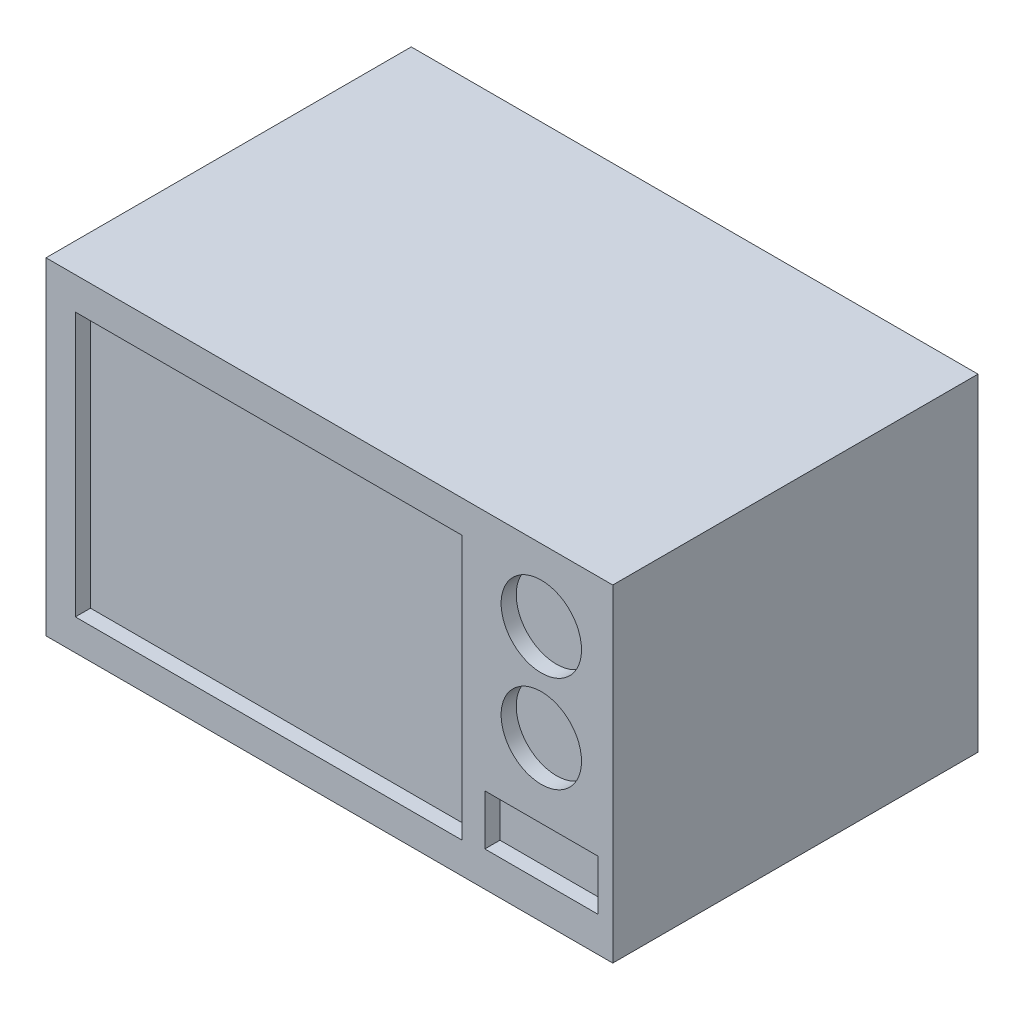
ISO-10303-21;
HEADER;
FILE_DESCRIPTION(('STEP AP214'),'2;1');
FILE_NAME('part.step','',(''),(''),'','','');
FILE_SCHEMA(('AUTOMOTIVE_DESIGN { 1 0 10303 214 1 1 1 1 }'));
ENDSEC;
DATA;
#1=APPLICATION_CONTEXT('core data for automotive mechanical design processes');
#2=APPLICATION_PROTOCOL_DEFINITION('international standard','automotive_design',2000,#1);
#3=PRODUCT_CONTEXT('',#1,'mechanical');
#4=PRODUCT('Part','Part','',(#3));
#5=PRODUCT_RELATED_PRODUCT_CATEGORY('part','',(#4));
#6=PRODUCT_DEFINITION_FORMATION('','',#4);
#7=PRODUCT_DEFINITION_CONTEXT('part definition',#1,'design');
#8=PRODUCT_DEFINITION('design','',#6,#7);
#9=PRODUCT_DEFINITION_SHAPE('','',#8);
#10=(LENGTH_UNIT() NAMED_UNIT(*) SI_UNIT(.MILLI.,.METRE.));
#11=(NAMED_UNIT(*) PLANE_ANGLE_UNIT() SI_UNIT($,.RADIAN.));
#12=(NAMED_UNIT(*) SI_UNIT($,.STERADIAN.) SOLID_ANGLE_UNIT());
#13=UNCERTAINTY_MEASURE_WITH_UNIT(LENGTH_MEASURE(1.E-05),#10,'distance_accuracy_value','');
#14=(GEOMETRIC_REPRESENTATION_CONTEXT(3) GLOBAL_UNCERTAINTY_ASSIGNED_CONTEXT((#13)) GLOBAL_UNIT_ASSIGNED_CONTEXT((#10,
#11,#12)) REPRESENTATION_CONTEXT('',''));
#15=CARTESIAN_POINT('',(0.,0.,0.));
#16=DIRECTION('',(0.,0.,1.));
#17=DIRECTION('',(1.,0.,0.));
#18=AXIS2_PLACEMENT_3D('',#15,#16,#17);
#19=CARTESIAN_POINT('',(225.,260.,-145.));
#20=DIRECTION('',(-1.,0.,0.));
#21=DIRECTION('',(0.,0.,1.));
#22=AXIS2_PLACEMENT_3D('',#19,#20,#21);
#23=PLANE('',#22);
#24=DIRECTION('',(0.,0.,-1.));
#25=VECTOR('',#24,1.);
#26=CARTESIAN_POINT('',(225.,0.,-145.));
#27=LINE('',#26,#25);
#28=CARTESIAN_POINT('',(225.,0.,145.));
#29=VERTEX_POINT('',#28);
#30=CARTESIAN_POINT('',(225.,0.,-145.));
#31=VERTEX_POINT('',#30);
#32=EDGE_CURVE('E227',#29,#31,#27,.T.);
#33=ORIENTED_EDGE('',*,*,#32,.T.);
#34=DIRECTION('',(0.,-1.,0.));
#35=VECTOR('',#34,1.);
#36=CARTESIAN_POINT('',(225.,260.,-145.));
#37=LINE('',#36,#35);
#38=CARTESIAN_POINT('',(225.,260.,-145.));
#39=VERTEX_POINT('',#38);
#40=EDGE_CURVE('E11',#39,#31,#37,.T.);
#41=ORIENTED_EDGE('',*,*,#40,.F.);
#42=DIRECTION('',(0.,0.,-1.));
#43=VECTOR('',#42,1.);
#44=CARTESIAN_POINT('',(225.,260.,-145.));
#45=LINE('',#44,#43);
#46=CARTESIAN_POINT('',(225.,260.,145.));
#47=VERTEX_POINT('',#46);
#48=EDGE_CURVE('E233',#47,#39,#45,.T.);
#49=ORIENTED_EDGE('',*,*,#48,.F.);
#50=DIRECTION('',(0.,-1.,0.));
#51=VECTOR('',#50,1.);
#52=CARTESIAN_POINT('',(225.,260.,145.));
#53=LINE('',#52,#51);
#54=EDGE_CURVE('E247',#47,#29,#53,.T.);
#55=ORIENTED_EDGE('',*,*,#54,.T.);
#56=EDGE_LOOP('',(#33,#41,#49,#55));
#57=FACE_BOUND('',#56,.T.);
#58=ADVANCED_FACE('F39',(#57),#23,.F.);
#59=CARTESIAN_POINT('',(-225.,260.,-145.));
#60=DIRECTION('',(0.,0.,1.));
#61=DIRECTION('',(1.,0.,0.));
#62=AXIS2_PLACEMENT_3D('',#59,#60,#61);
#63=PLANE('',#62);
#64=DIRECTION('',(-1.,0.,0.));
#65=VECTOR('',#64,1.);
#66=CARTESIAN_POINT('',(-225.,0.,-145.));
#67=LINE('',#66,#65);
#68=CARTESIAN_POINT('',(-225.,0.,-145.));
#69=VERTEX_POINT('',#68);
#70=EDGE_CURVE('E251',#31,#69,#67,.T.);
#71=ORIENTED_EDGE('',*,*,#70,.T.);
#72=DIRECTION('',(0.,-1.,0.));
#73=VECTOR('',#72,1.);
#74=CARTESIAN_POINT('',(-225.,260.,-145.));
#75=LINE('',#74,#73);
#76=CARTESIAN_POINT('',(-225.,260.,-145.));
#77=VERTEX_POINT('',#76);
#78=EDGE_CURVE('E47',#77,#69,#75,.T.);
#79=ORIENTED_EDGE('',*,*,#78,.F.);
#80=DIRECTION('',(-1.,0.,0.));
#81=VECTOR('',#80,1.);
#82=CARTESIAN_POINT('',(-225.,260.,-145.));
#83=LINE('',#82,#81);
#84=EDGE_CURVE('E237',#39,#77,#83,.T.);
#85=ORIENTED_EDGE('',*,*,#84,.F.);
#86=ORIENTED_EDGE('',*,*,#40,.T.);
#87=EDGE_LOOP('',(#71,#79,#85,#86));
#88=FACE_BOUND('',#87,.T.);
#89=ADVANCED_FACE('F287',(#88),#63,.F.);
#90=CARTESIAN_POINT('',(-225.,260.,-145.));
#91=DIRECTION('',(1.,0.,0.));
#92=DIRECTION('',(0.,0.,-1.));
#93=AXIS2_PLACEMENT_3D('',#90,#91,#92);
#94=PLANE('',#93);
#95=DIRECTION('',(0.,0.,1.));
#96=VECTOR('',#95,1.);
#97=CARTESIAN_POINT('',(-225.,0.,-145.));
#98=LINE('',#97,#96);
#99=CARTESIAN_POINT('',(-225.,0.,145.));
#100=VERTEX_POINT('',#99);
#101=EDGE_CURVE('E254',#69,#100,#98,.T.);
#102=ORIENTED_EDGE('',*,*,#101,.T.);
#103=DIRECTION('',(0.,-1.,0.));
#104=VECTOR('',#103,1.);
#105=CARTESIAN_POINT('',(-225.,260.,145.));
#106=LINE('',#105,#104);
#107=CARTESIAN_POINT('',(-225.,260.,145.));
#108=VERTEX_POINT('',#107);
#109=EDGE_CURVE('E262',#108,#100,#106,.T.);
#110=ORIENTED_EDGE('',*,*,#109,.F.);
#111=DIRECTION('',(0.,0.,1.));
#112=VECTOR('',#111,1.);
#113=CARTESIAN_POINT('',(-225.,260.,-145.));
#114=LINE('',#113,#112);
#115=EDGE_CURVE('E241',#77,#108,#114,.T.);
#116=ORIENTED_EDGE('',*,*,#115,.F.);
#117=ORIENTED_EDGE('',*,*,#78,.T.);
#118=EDGE_LOOP('',(#102,#110,#116,#117));
#119=FACE_BOUND('',#118,.T.);
#120=ADVANCED_FACE('F271',(#119),#94,.F.);
#121=CARTESIAN_POINT('',(-225.,260.,145.));
#122=DIRECTION('',(0.,0.,-1.));
#123=DIRECTION('',(-1.,0.,0.));
#124=AXIS2_PLACEMENT_3D('',#121,#122,#123);
#125=PLANE('',#124);
#126=DIRECTION('',(-1.,0.,0.));
#127=VECTOR('',#126,1.);
#128=CARTESIAN_POINT('',(-201.676981147842,234.349718550989,145.));
#129=LINE('',#128,#127);
#130=CARTESIAN_POINT('',(105.310715864301,234.349718550989,145.));
#131=VERTEX_POINT('',#130);
#132=CARTESIAN_POINT('',(-201.676981147842,234.349718550989,145.));
#133=VERTEX_POINT('',#132);
#134=EDGE_CURVE('E202',#131,#133,#129,.T.);
#135=ORIENTED_EDGE('',*,*,#134,.F.);
#136=DIRECTION('',(0.,1.,0.));
#137=VECTOR('',#136,1.);
#138=CARTESIAN_POINT('',(105.310715864301,234.349718550989,145.));
#139=LINE('',#138,#137);
#140=CARTESIAN_POINT('',(105.310715864301,24.7169161931593,145.));
#141=VERTEX_POINT('',#140);
#142=EDGE_CURVE('E54',#141,#131,#139,.T.);
#143=ORIENTED_EDGE('',*,*,#142,.F.);
#144=DIRECTION('',(1.,0.,0.));
#145=VECTOR('',#144,1.);
#146=CARTESIAN_POINT('',(-201.676981147842,24.7169161931593,145.));
#147=LINE('',#146,#145);
#148=CARTESIAN_POINT('',(-201.676981147842,24.7169161931593,145.));
#149=VERTEX_POINT('',#148);
#150=EDGE_CURVE('E187',#149,#141,#147,.T.);
#151=ORIENTED_EDGE('',*,*,#150,.F.);
#152=DIRECTION('',(0.,-1.,0.));
#153=VECTOR('',#152,1.);
#154=CARTESIAN_POINT('',(-201.676981147842,234.349718550989,145.));
#155=LINE('',#154,#153);
#156=EDGE_CURVE('E206',#133,#149,#155,.T.);
#157=ORIENTED_EDGE('',*,*,#156,.F.);
#158=EDGE_LOOP('',(#135,#143,#151,#157));
#159=FACE_BOUND('',#158,.T.);
#160=DIRECTION('',(-1.,0.,0.));
#161=VECTOR('',#160,1.);
#162=CARTESIAN_POINT('',(123.433147095085,67.6835893136013,145.));
#163=LINE('',#162,#161);
#164=CARTESIAN_POINT('',(213.118654386862,67.6835893136013,145.));
#165=VERTEX_POINT('',#164);
#166=CARTESIAN_POINT('',(123.433147095085,67.6835893136013,145.));
#167=VERTEX_POINT('',#166);
#168=EDGE_CURVE('E167',#165,#167,#163,.T.);
#169=ORIENTED_EDGE('',*,*,#168,.F.);
#170=DIRECTION('',(0.,1.,0.));
#171=VECTOR('',#170,1.);
#172=CARTESIAN_POINT('',(213.118654386862,67.6835893136013,145.));
#173=LINE('',#172,#171);
#174=CARTESIAN_POINT('',(213.118654386862,27.7112329318119,145.));
#175=VERTEX_POINT('',#174);
#176=EDGE_CURVE('E62',#175,#165,#173,.T.);
#177=ORIENTED_EDGE('',*,*,#176,.F.);
#178=DIRECTION('',(1.,0.,0.));
#179=VECTOR('',#178,1.);
#180=CARTESIAN_POINT('',(123.433147095085,27.7112329318119,145.));
#181=LINE('',#180,#179);
#182=CARTESIAN_POINT('',(123.433147095085,27.7112329318119,145.));
#183=VERTEX_POINT('',#182);
#184=EDGE_CURVE('E151',#183,#175,#181,.T.);
#185=ORIENTED_EDGE('',*,*,#184,.F.);
#186=DIRECTION('',(0.,-1.,0.));
#187=VECTOR('',#186,1.);
#188=CARTESIAN_POINT('',(123.433147095085,67.6835893136013,145.));
#189=LINE('',#188,#187);
#190=EDGE_CURVE('E155',#167,#183,#189,.T.);
#191=ORIENTED_EDGE('',*,*,#190,.F.);
#192=EDGE_LOOP('',(#169,#177,#185,#191));
#193=FACE_BOUND('',#192,.T.);
#194=CARTESIAN_POINT('',(168.275900740974,126.418305405309,145.));
#195=DIRECTION('',(0.,0.,1.));
#196=DIRECTION('',(1.,0.,0.));
#197=AXIS2_PLACEMENT_3D('',#194,#195,#196);
#198=CIRCLE('',#197,31.9152905653367);
#199=CARTESIAN_POINT('',(200.19119130631,126.418305405309,145.));
#200=VERTEX_POINT('',#199);
#201=EDGE_CURVE('E158',#200,#200,#198,.T.);
#202=ORIENTED_EDGE('',*,*,#201,.F.);
#203=EDGE_LOOP('',(#202));
#204=FACE_BOUND('',#203,.T.);
#205=CARTESIAN_POINT('',(168.275900740974,203.066569731717,145.));
#206=DIRECTION('',(0.,0.,1.));
#207=DIRECTION('',(1.,0.,0.));
#208=AXIS2_PLACEMENT_3D('',#205,#206,#207);
#209=CIRCLE('',#208,31.9152905653367);
#210=CARTESIAN_POINT('',(200.19119130631,203.066569731717,145.));
#211=VERTEX_POINT('',#210);
#212=EDGE_CURVE('E228',#211,#211,#209,.T.);
#213=ORIENTED_EDGE('',*,*,#212,.F.);
#214=EDGE_LOOP('',(#213));
#215=FACE_BOUND('',#214,.T.);
#216=DIRECTION('',(1.,0.,0.));
#217=VECTOR('',#216,1.);
#218=CARTESIAN_POINT('',(-225.,0.,145.));
#219=LINE('',#218,#217);
#220=EDGE_CURVE('E238',#100,#29,#219,.T.);
#221=ORIENTED_EDGE('',*,*,#220,.T.);
#222=ORIENTED_EDGE('',*,*,#54,.F.);
#223=DIRECTION('',(1.,0.,0.));
#224=VECTOR('',#223,1.);
#225=CARTESIAN_POINT('',(-225.,260.,145.));
#226=LINE('',#225,#224);
#227=EDGE_CURVE('E244',#108,#47,#226,.T.);
#228=ORIENTED_EDGE('',*,*,#227,.F.);
#229=ORIENTED_EDGE('',*,*,#109,.T.);
#230=EDGE_LOOP('',(#221,#222,#228,#229));
#231=FACE_BOUND('',#230,.T.);
#232=ADVANCED_FACE('F280',(#159,#193,#204,#215,#231),#125,.F.);
#233=CARTESIAN_POINT('',(0.,260.,0.));
#234=DIRECTION('',(0.,1.,0.));
#235=DIRECTION('',(0.,0.,1.));
#236=AXIS2_PLACEMENT_3D('',#233,#234,#235);
#237=PLANE('',#236);
#238=ORIENTED_EDGE('',*,*,#48,.T.);
#239=ORIENTED_EDGE('',*,*,#84,.T.);
#240=ORIENTED_EDGE('',*,*,#115,.T.);
#241=ORIENTED_EDGE('',*,*,#227,.T.);
#242=EDGE_LOOP('',(#238,#239,#240,#241));
#243=FACE_BOUND('',#242,.T.);
#244=ADVANCED_FACE('F286',(#243),#237,.T.);
#245=CARTESIAN_POINT('',(0.,0.,0.));
#246=DIRECTION('',(0.,1.,0.));
#247=DIRECTION('',(0.,0.,1.));
#248=AXIS2_PLACEMENT_3D('',#245,#246,#247);
#249=PLANE('',#248);
#250=ORIENTED_EDGE('',*,*,#32,.F.);
#251=ORIENTED_EDGE('',*,*,#220,.F.);
#252=ORIENTED_EDGE('',*,*,#101,.F.);
#253=ORIENTED_EDGE('',*,*,#70,.F.);
#254=EDGE_LOOP('',(#250,#251,#252,#253));
#255=FACE_BOUND('',#254,.T.);
#256=ADVANCED_FACE('F277',(#255),#249,.F.);
#257=CARTESIAN_POINT('',(168.275900740974,203.066569731717,133.));
#258=DIRECTION('',(0.,0.,1.));
#259=DIRECTION('',(1.,0.,0.));
#260=AXIS2_PLACEMENT_3D('',#257,#258,#259);
#261=CYLINDRICAL_SURFACE('',#260,31.9152905653367);
#262=CARTESIAN_POINT('',(168.275900740974,203.066569731717,133.));
#263=DIRECTION('',(0.,0.,1.));
#264=DIRECTION('',(1.,0.,0.));
#265=AXIS2_PLACEMENT_3D('',#262,#263,#264);
#266=CIRCLE('',#265,31.9152905653367);
#267=CARTESIAN_POINT('',(200.19119130631,203.066569731717,133.));
#268=VERTEX_POINT('',#267);
#269=EDGE_CURVE('E223',#268,#268,#266,.T.);
#270=ORIENTED_EDGE('',*,*,#269,.F.);
#271=EDGE_LOOP('',(#270));
#272=FACE_BOUND('',#271,.T.);
#273=ORIENTED_EDGE('',*,*,#212,.T.);
#274=EDGE_LOOP('',(#273));
#275=FACE_BOUND('',#274,.T.);
#276=ADVANCED_FACE('F300',(#272,#275),#261,.F.);
#277=CARTESIAN_POINT('',(168.275900740974,203.066569731717,133.));
#278=DIRECTION('',(0.,0.,1.));
#279=DIRECTION('',(1.,0.,0.));
#280=AXIS2_PLACEMENT_3D('',#277,#278,#279);
#281=PLANE('',#280);
#282=ORIENTED_EDGE('',*,*,#269,.T.);
#283=EDGE_LOOP('',(#282));
#284=FACE_BOUND('',#283,.T.);
#285=ADVANCED_FACE('F305',(#284),#281,.T.);
#286=CARTESIAN_POINT('',(168.275900740974,126.418305405309,133.));
#287=DIRECTION('',(0.,0.,1.));
#288=DIRECTION('',(1.,0.,0.));
#289=AXIS2_PLACEMENT_3D('',#286,#287,#288);
#290=CYLINDRICAL_SURFACE('',#289,31.9152905653367);
#291=CARTESIAN_POINT('',(168.275900740974,126.418305405309,133.));
#292=DIRECTION('',(0.,0.,1.));
#293=DIRECTION('',(1.,0.,0.));
#294=AXIS2_PLACEMENT_3D('',#291,#292,#293);
#295=CIRCLE('',#294,31.9152905653367);
#296=CARTESIAN_POINT('',(200.19119130631,126.418305405309,133.));
#297=VERTEX_POINT('',#296);
#298=EDGE_CURVE('E232',#297,#297,#295,.T.);
#299=ORIENTED_EDGE('',*,*,#298,.F.);
#300=EDGE_LOOP('',(#299));
#301=FACE_BOUND('',#300,.T.);
#302=ORIENTED_EDGE('',*,*,#201,.T.);
#303=EDGE_LOOP('',(#302));
#304=FACE_BOUND('',#303,.T.);
#305=ADVANCED_FACE('F309',(#301,#304),#290,.F.);
#306=CARTESIAN_POINT('',(168.275900740974,126.418305405309,133.));
#307=DIRECTION('',(0.,0.,1.));
#308=DIRECTION('',(1.,0.,0.));
#309=AXIS2_PLACEMENT_3D('',#306,#307,#308);
#310=PLANE('',#309);
#311=ORIENTED_EDGE('',*,*,#298,.T.);
#312=EDGE_LOOP('',(#311));
#313=FACE_BOUND('',#312,.T.);
#314=ADVANCED_FACE('F333',(#313),#310,.T.);
#315=CARTESIAN_POINT('',(213.118654386862,67.6835893136013,133.));
#316=DIRECTION('',(1.,0.,0.));
#317=DIRECTION('',(0.,0.,-1.));
#318=AXIS2_PLACEMENT_3D('',#315,#316,#317);
#319=PLANE('',#318);
#320=ORIENTED_EDGE('',*,*,#176,.T.);
#321=DIRECTION('',(0.,0.,1.));
#322=VECTOR('',#321,1.);
#323=CARTESIAN_POINT('',(213.118654386862,67.6835893136013,133.));
#324=LINE('',#323,#322);
#325=CARTESIAN_POINT('',(213.118654386862,67.6835893136013,133.));
#326=VERTEX_POINT('',#325);
#327=EDGE_CURVE('E126',#326,#165,#324,.T.);
#328=ORIENTED_EDGE('',*,*,#327,.F.);
#329=DIRECTION('',(0.,1.,0.));
#330=VECTOR('',#329,1.);
#331=CARTESIAN_POINT('',(213.118654386862,67.6835893136013,133.));
#332=LINE('',#331,#330);
#333=CARTESIAN_POINT('',(213.118654386862,27.7112329318119,133.));
#334=VERTEX_POINT('',#333);
#335=EDGE_CURVE('E130',#334,#326,#332,.T.);
#336=ORIENTED_EDGE('',*,*,#335,.F.);
#337=DIRECTION('',(0.,0.,1.));
#338=VECTOR('',#337,1.);
#339=CARTESIAN_POINT('',(213.118654386862,27.7112329318119,133.));
#340=LINE('',#339,#338);
#341=EDGE_CURVE('E174',#334,#175,#340,.T.);
#342=ORIENTED_EDGE('',*,*,#341,.T.);
#343=EDGE_LOOP('',(#320,#328,#336,#342));
#344=FACE_BOUND('',#343,.T.);
#345=ADVANCED_FACE('F128',(#344),#319,.F.);
#346=CARTESIAN_POINT('',(123.433147095085,27.7112329318119,133.));
#347=DIRECTION('',(0.,-1.,0.));
#348=DIRECTION('',(0.,0.,-1.));
#349=AXIS2_PLACEMENT_3D('',#346,#347,#348);
#350=PLANE('',#349);
#351=ORIENTED_EDGE('',*,*,#184,.T.);
#352=ORIENTED_EDGE('',*,*,#341,.F.);
#353=DIRECTION('',(1.,0.,0.));
#354=VECTOR('',#353,1.);
#355=CARTESIAN_POINT('',(123.433147095085,27.7112329318119,133.));
#356=LINE('',#355,#354);
#357=CARTESIAN_POINT('',(123.433147095085,27.7112329318119,133.));
#358=VERTEX_POINT('',#357);
#359=EDGE_CURVE('E137',#358,#334,#356,.T.);
#360=ORIENTED_EDGE('',*,*,#359,.F.);
#361=DIRECTION('',(0.,0.,1.));
#362=VECTOR('',#361,1.);
#363=CARTESIAN_POINT('',(123.433147095085,27.7112329318119,133.));
#364=LINE('',#363,#362);
#365=EDGE_CURVE('E177',#358,#183,#364,.T.);
#366=ORIENTED_EDGE('',*,*,#365,.T.);
#367=EDGE_LOOP('',(#351,#352,#360,#366));
#368=FACE_BOUND('',#367,.T.);
#369=ADVANCED_FACE('F332',(#368),#350,.F.);
#370=CARTESIAN_POINT('',(123.433147095085,67.6835893136013,133.));
#371=DIRECTION('',(-1.,0.,0.));
#372=DIRECTION('',(0.,0.,1.));
#373=AXIS2_PLACEMENT_3D('',#370,#371,#372);
#374=PLANE('',#373);
#375=ORIENTED_EDGE('',*,*,#190,.T.);
#376=ORIENTED_EDGE('',*,*,#365,.F.);
#377=DIRECTION('',(0.,-1.,0.));
#378=VECTOR('',#377,1.);
#379=CARTESIAN_POINT('',(123.433147095085,67.6835893136013,133.));
#380=LINE('',#379,#378);
#381=CARTESIAN_POINT('',(123.433147095085,67.6835893136013,133.));
#382=VERTEX_POINT('',#381);
#383=EDGE_CURVE('E146',#382,#358,#380,.T.);
#384=ORIENTED_EDGE('',*,*,#383,.F.);
#385=DIRECTION('',(0.,0.,1.));
#386=VECTOR('',#385,1.);
#387=CARTESIAN_POINT('',(123.433147095085,67.6835893136013,133.));
#388=LINE('',#387,#386);
#389=EDGE_CURVE('E136',#382,#167,#388,.T.);
#390=ORIENTED_EDGE('',*,*,#389,.T.);
#391=EDGE_LOOP('',(#375,#376,#384,#390));
#392=FACE_BOUND('',#391,.T.);
#393=ADVANCED_FACE('F336',(#392),#374,.F.);
#394=CARTESIAN_POINT('',(123.433147095085,67.6835893136013,133.));
#395=DIRECTION('',(0.,1.,0.));
#396=DIRECTION('',(0.,0.,1.));
#397=AXIS2_PLACEMENT_3D('',#394,#395,#396);
#398=PLANE('',#397);
#399=ORIENTED_EDGE('',*,*,#168,.T.);
#400=ORIENTED_EDGE('',*,*,#389,.F.);
#401=DIRECTION('',(-1.,0.,0.));
#402=VECTOR('',#401,1.);
#403=CARTESIAN_POINT('',(123.433147095085,67.6835893136013,133.));
#404=LINE('',#403,#402);
#405=EDGE_CURVE('E140',#326,#382,#404,.T.);
#406=ORIENTED_EDGE('',*,*,#405,.F.);
#407=ORIENTED_EDGE('',*,*,#327,.T.);
#408=EDGE_LOOP('',(#399,#400,#406,#407));
#409=FACE_BOUND('',#408,.T.);
#410=ADVANCED_FACE('F141',(#409),#398,.F.);
#411=CARTESIAN_POINT('',(0.,0.,133.));
#412=DIRECTION('',(0.,0.,1.));
#413=DIRECTION('',(1.,0.,0.));
#414=AXIS2_PLACEMENT_3D('',#411,#412,#413);
#415=PLANE('',#414);
#416=ORIENTED_EDGE('',*,*,#335,.T.);
#417=ORIENTED_EDGE('',*,*,#405,.T.);
#418=ORIENTED_EDGE('',*,*,#383,.T.);
#419=ORIENTED_EDGE('',*,*,#359,.T.);
#420=EDGE_LOOP('',(#416,#417,#418,#419));
#421=FACE_BOUND('',#420,.T.);
#422=ADVANCED_FACE('F148',(#421),#415,.T.);
#423=CARTESIAN_POINT('',(105.310715864301,234.349718550989,133.));
#424=DIRECTION('',(1.,0.,0.));
#425=DIRECTION('',(0.,1.,0.));
#426=AXIS2_PLACEMENT_3D('',#423,#424,#425);
#427=PLANE('',#426);
#428=ORIENTED_EDGE('',*,*,#142,.T.);
#429=DIRECTION('',(0.,0.,1.));
#430=VECTOR('',#429,1.);
#431=CARTESIAN_POINT('',(105.310715864301,234.349718550989,133.));
#432=LINE('',#431,#430);
#433=CARTESIAN_POINT('',(105.310715864301,234.349718550989,133.));
#434=VERTEX_POINT('',#433);
#435=EDGE_CURVE('E199',#434,#131,#432,.T.);
#436=ORIENTED_EDGE('',*,*,#435,.F.);
#437=DIRECTION('',(0.,1.,0.));
#438=VECTOR('',#437,1.);
#439=CARTESIAN_POINT('',(105.310715864301,234.349718550989,133.));
#440=LINE('',#439,#438);
#441=CARTESIAN_POINT('',(105.310715864301,24.7169161931593,133.));
#442=VERTEX_POINT('',#441);
#443=EDGE_CURVE('E182',#442,#434,#440,.T.);
#444=ORIENTED_EDGE('',*,*,#443,.F.);
#445=DIRECTION('',(0.,0.,1.));
#446=VECTOR('',#445,1.);
#447=CARTESIAN_POINT('',(105.310715864301,24.7169161931593,133.));
#448=LINE('',#447,#446);
#449=EDGE_CURVE('E168',#442,#141,#448,.T.);
#450=ORIENTED_EDGE('',*,*,#449,.T.);
#451=EDGE_LOOP('',(#428,#436,#444,#450));
#452=FACE_BOUND('',#451,.T.);
#453=ADVANCED_FACE('F311',(#452),#427,.F.);
#454=CARTESIAN_POINT('',(-201.676981147842,24.7169161931593,133.));
#455=DIRECTION('',(0.,-1.,0.));
#456=DIRECTION('',(0.,0.,-1.));
#457=AXIS2_PLACEMENT_3D('',#454,#455,#456);
#458=PLANE('',#457);
#459=ORIENTED_EDGE('',*,*,#150,.T.);
#460=ORIENTED_EDGE('',*,*,#449,.F.);
#461=DIRECTION('',(1.,0.,0.));
#462=VECTOR('',#461,1.);
#463=CARTESIAN_POINT('',(-201.676981147842,24.7169161931593,133.));
#464=LINE('',#463,#462);
#465=CARTESIAN_POINT('',(-201.676981147842,24.7169161931593,133.));
#466=VERTEX_POINT('',#465);
#467=EDGE_CURVE('E195',#466,#442,#464,.T.);
#468=ORIENTED_EDGE('',*,*,#467,.F.);
#469=DIRECTION('',(0.,0.,1.));
#470=VECTOR('',#469,1.);
#471=CARTESIAN_POINT('',(-201.676981147842,24.7169161931593,133.));
#472=LINE('',#471,#470);
#473=EDGE_CURVE('E215',#466,#149,#472,.T.);
#474=ORIENTED_EDGE('',*,*,#473,.T.);
#475=EDGE_LOOP('',(#459,#460,#468,#474));
#476=FACE_BOUND('',#475,.T.);
#477=ADVANCED_FACE('F314',(#476),#458,.F.);
#478=CARTESIAN_POINT('',(-201.676981147842,234.349718550989,133.));
#479=DIRECTION('',(-1.,0.,0.));
#480=DIRECTION('',(0.,-1.,0.));
#481=AXIS2_PLACEMENT_3D('',#478,#479,#480);
#482=PLANE('',#481);
#483=ORIENTED_EDGE('',*,*,#156,.T.);
#484=ORIENTED_EDGE('',*,*,#473,.F.);
#485=DIRECTION('',(0.,-1.,0.));
#486=VECTOR('',#485,1.);
#487=CARTESIAN_POINT('',(-201.676981147842,234.349718550989,133.));
#488=LINE('',#487,#486);
#489=CARTESIAN_POINT('',(-201.676981147842,234.349718550989,133.));
#490=VERTEX_POINT('',#489);
#491=EDGE_CURVE('E191',#490,#466,#488,.T.);
#492=ORIENTED_EDGE('',*,*,#491,.F.);
#493=DIRECTION('',(0.,0.,1.));
#494=VECTOR('',#493,1.);
#495=CARTESIAN_POINT('',(-201.676981147842,234.349718550989,133.));
#496=LINE('',#495,#494);
#497=EDGE_CURVE('E218',#490,#133,#496,.T.);
#498=ORIENTED_EDGE('',*,*,#497,.T.);
#499=EDGE_LOOP('',(#483,#484,#492,#498));
#500=FACE_BOUND('',#499,.T.);
#501=ADVANCED_FACE('F319',(#500),#482,.F.);
#502=CARTESIAN_POINT('',(-201.676981147842,234.349718550989,133.));
#503=DIRECTION('',(0.,1.,0.));
#504=DIRECTION('',(0.,0.,1.));
#505=AXIS2_PLACEMENT_3D('',#502,#503,#504);
#506=PLANE('',#505);
#507=ORIENTED_EDGE('',*,*,#134,.T.);
#508=ORIENTED_EDGE('',*,*,#497,.F.);
#509=DIRECTION('',(-1.,0.,0.));
#510=VECTOR('',#509,1.);
#511=CARTESIAN_POINT('',(-201.676981147842,234.349718550989,133.));
#512=LINE('',#511,#510);
#513=EDGE_CURVE('E186',#434,#490,#512,.T.);
#514=ORIENTED_EDGE('',*,*,#513,.F.);
#515=ORIENTED_EDGE('',*,*,#435,.T.);
#516=EDGE_LOOP('',(#507,#508,#514,#515));
#517=FACE_BOUND('',#516,.T.);
#518=ADVANCED_FACE('F315',(#517),#506,.F.);
#519=CARTESIAN_POINT('',(0.,0.,133.));
#520=DIRECTION('',(0.,0.,1.));
#521=DIRECTION('',(1.,0.,0.));
#522=AXIS2_PLACEMENT_3D('',#519,#520,#521);
#523=PLANE('',#522);
#524=ORIENTED_EDGE('',*,*,#443,.T.);
#525=ORIENTED_EDGE('',*,*,#513,.T.);
#526=ORIENTED_EDGE('',*,*,#491,.T.);
#527=ORIENTED_EDGE('',*,*,#467,.T.);
#528=EDGE_LOOP('',(#524,#525,#526,#527));
#529=FACE_BOUND('',#528,.T.);
#530=ADVANCED_FACE('F318',(#529),#523,.T.);
#531=CLOSED_SHELL('',(#58,#89,#120,#232,#244,#256,#276,#285,#305,#314,#345,#369,#393,#410,#422,
#453,#477,#501,#518,#530));
#532=MANIFOLD_SOLID_BREP('B2',#531);
#533=ADVANCED_BREP_SHAPE_REPRESENTATION('',(#18,#532),#14);
#534=SHAPE_DEFINITION_REPRESENTATION(#9,#533);
ENDSEC;
END-ISO-10303-21;
